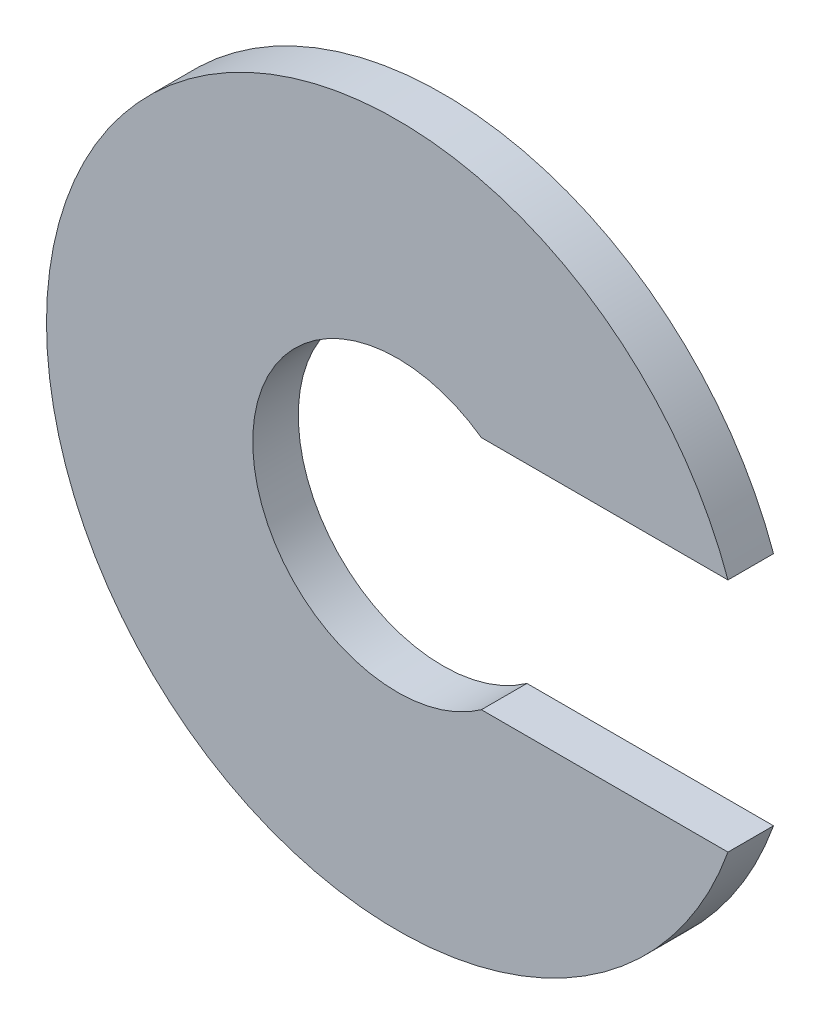
ISO-10303-21;
HEADER;
FILE_DESCRIPTION(('STEP AP214'),'2;1');
FILE_NAME('part.step','',(''),(''),'','','');
FILE_SCHEMA(('AUTOMOTIVE_DESIGN { 1 0 10303 214 1 1 1 1 }'));
ENDSEC;
DATA;
#1=APPLICATION_CONTEXT('core data for automotive mechanical design processes');
#2=APPLICATION_PROTOCOL_DEFINITION('international standard','automotive_design',2000,#1);
#3=PRODUCT_CONTEXT('',#1,'mechanical');
#4=PRODUCT('Part','Part','',(#3));
#5=PRODUCT_RELATED_PRODUCT_CATEGORY('part','',(#4));
#6=PRODUCT_DEFINITION_FORMATION('','',#4);
#7=PRODUCT_DEFINITION_CONTEXT('part definition',#1,'design');
#8=PRODUCT_DEFINITION('design','',#6,#7);
#9=PRODUCT_DEFINITION_SHAPE('','',#8);
#10=(LENGTH_UNIT() NAMED_UNIT(*) SI_UNIT(.MILLI.,.METRE.));
#11=(NAMED_UNIT(*) PLANE_ANGLE_UNIT() SI_UNIT($,.RADIAN.));
#12=(NAMED_UNIT(*) SI_UNIT($,.STERADIAN.) SOLID_ANGLE_UNIT());
#13=UNCERTAINTY_MEASURE_WITH_UNIT(LENGTH_MEASURE(1.E-05),#10,'distance_accuracy_value','');
#14=(GEOMETRIC_REPRESENTATION_CONTEXT(3) GLOBAL_UNCERTAINTY_ASSIGNED_CONTEXT((#13)) GLOBAL_UNIT_ASSIGNED_CONTEXT((#10,
#11,#12)) REPRESENTATION_CONTEXT('',''));
#15=CARTESIAN_POINT('',(0.,0.,0.));
#16=DIRECTION('',(0.,0.,1.));
#17=DIRECTION('',(1.,0.,0.));
#18=AXIS2_PLACEMENT_3D('',#15,#16,#17);
#19=CARTESIAN_POINT('',(0.,0.,0.739999999999991));
#20=DIRECTION('',(0.,0.,1.));
#21=DIRECTION('',(-1.,0.,0.));
#22=AXIS2_PLACEMENT_3D('',#19,#20,#21);
#23=PLANE('',#22);
#24=CARTESIAN_POINT('',(0.,0.,0.739999999999991));
#25=DIRECTION('',(0.,0.,1.));
#26=DIRECTION('',(1.,0.,0.));
#27=AXIS2_PLACEMENT_3D('',#24,#25,#26);
#28=CIRCLE('',#27,2.35000000000001);
#29=CARTESIAN_POINT('',(1.36381816969866,1.91376592090042,0.739999999999991));
#30=VERTEX_POINT('',#29);
#31=CARTESIAN_POINT('',(1.36381816969866,-1.91376592090042,0.739999999999991));
#32=VERTEX_POINT('',#31);
#33=EDGE_CURVE('E47',#30,#32,#28,.T.);
#34=ORIENTED_EDGE('',*,*,#33,.F.);
#35=DIRECTION('',(1.,0.,0.));
#36=VECTOR('',#35,1.);
#37=CARTESIAN_POINT('',(1.36381816969867,1.91376592090042,0.739999999999991));
#38=LINE('',#37,#36);
#39=CARTESIAN_POINT('',(5.36912469588854,1.91376592090042,0.739999999999994));
#40=VERTEX_POINT('',#39);
#41=EDGE_CURVE('E70',#30,#40,#38,.T.);
#42=ORIENTED_EDGE('',*,*,#41,.T.);
#43=CARTESIAN_POINT('',(0.,0.,0.739999999999991));
#44=DIRECTION('',(0.,0.,1.));
#45=DIRECTION('',(1.,0.,0.));
#46=AXIS2_PLACEMENT_3D('',#43,#44,#45);
#47=CIRCLE('',#46,5.7);
#48=CARTESIAN_POINT('',(5.36912469588854,-1.91376592090042,0.739999999999991));
#49=VERTEX_POINT('',#48);
#50=EDGE_CURVE('E75',#40,#49,#47,.T.);
#51=ORIENTED_EDGE('',*,*,#50,.T.);
#52=DIRECTION('',(1.,0.,0.));
#53=VECTOR('',#52,1.);
#54=CARTESIAN_POINT('',(1.36381816969867,-1.91376592090042,0.739999999999991));
#55=LINE('',#54,#53);
#56=EDGE_CURVE('E90',#32,#49,#55,.T.);
#57=ORIENTED_EDGE('',*,*,#56,.F.);
#58=EDGE_LOOP('',(#34,#42,#51,#57));
#59=FACE_BOUND('',#58,.T.);
#60=ADVANCED_FACE('F39',(#59),#23,.T.);
#61=CARTESIAN_POINT('',(0.,0.,0.));
#62=DIRECTION('',(0.,0.,1.));
#63=DIRECTION('',(1.,0.,0.));
#64=AXIS2_PLACEMENT_3D('',#61,#62,#63);
#65=PLANE('',#64);
#66=CARTESIAN_POINT('',(0.,0.,0.));
#67=DIRECTION('',(0.,0.,1.));
#68=DIRECTION('',(1.,0.,0.));
#69=AXIS2_PLACEMENT_3D('',#66,#67,#68);
#70=CIRCLE('',#69,2.35000000000001);
#71=CARTESIAN_POINT('',(1.36381816969866,1.91376592090042,0.));
#72=VERTEX_POINT('',#71);
#73=CARTESIAN_POINT('',(1.36381816969866,-1.91376592090042,0.));
#74=VERTEX_POINT('',#73);
#75=EDGE_CURVE('E99',#72,#74,#70,.T.);
#76=ORIENTED_EDGE('',*,*,#75,.T.);
#77=DIRECTION('',(1.,0.,0.));
#78=VECTOR('',#77,1.);
#79=CARTESIAN_POINT('',(1.36381816969866,-1.91376592090042,0.));
#80=LINE('',#79,#78);
#81=CARTESIAN_POINT('',(5.36912469588854,-1.91376592090042,0.));
#82=VERTEX_POINT('',#81);
#83=EDGE_CURVE('E88',#74,#82,#80,.T.);
#84=ORIENTED_EDGE('',*,*,#83,.T.);
#85=CARTESIAN_POINT('',(0.,0.,0.));
#86=DIRECTION('',(0.,0.,1.));
#87=DIRECTION('',(1.,0.,0.));
#88=AXIS2_PLACEMENT_3D('',#85,#86,#87);
#89=CIRCLE('',#88,5.7);
#90=CARTESIAN_POINT('',(5.36912469588854,1.91376592090042,0.));
#91=VERTEX_POINT('',#90);
#92=EDGE_CURVE('E92',#91,#82,#89,.T.);
#93=ORIENTED_EDGE('',*,*,#92,.F.);
#94=DIRECTION('',(1.,0.,0.));
#95=VECTOR('',#94,1.);
#96=CARTESIAN_POINT('',(1.36381816969866,1.91376592090042,0.));
#97=LINE('',#96,#95);
#98=EDGE_CURVE('E106',#72,#91,#97,.T.);
#99=ORIENTED_EDGE('',*,*,#98,.F.);
#100=EDGE_LOOP('',(#76,#84,#93,#99));
#101=FACE_BOUND('',#100,.T.);
#102=ADVANCED_FACE('F98',(#101),#65,.F.);
#103=CARTESIAN_POINT('',(1.36381816969866,-1.91376592090042,16.6297929984355));
#104=DIRECTION('',(0.,1.,0.));
#105=DIRECTION('',(-1.,0.,0.));
#106=AXIS2_PLACEMENT_3D('',#103,#104,#105);
#107=PLANE('',#106);
#108=DIRECTION('',(0.,0.,-1.));
#109=VECTOR('',#108,1.);
#110=CARTESIAN_POINT('',(1.36381816969866,-1.91376592090042,16.6297929984355));
#111=LINE('',#110,#109);
#112=EDGE_CURVE('E11',#32,#74,#111,.T.);
#113=ORIENTED_EDGE('',*,*,#112,.F.);
#114=ORIENTED_EDGE('',*,*,#56,.T.);
#115=DIRECTION('',(0.,0.,-1.));
#116=VECTOR('',#115,1.);
#117=CARTESIAN_POINT('',(5.36912469588854,-1.91376592090042,16.6297929984355));
#118=LINE('',#117,#116);
#119=EDGE_CURVE('E85',#49,#82,#118,.T.);
#120=ORIENTED_EDGE('',*,*,#119,.T.);
#121=ORIENTED_EDGE('',*,*,#83,.F.);
#122=EDGE_LOOP('',(#113,#114,#120,#121));
#123=FACE_BOUND('',#122,.T.);
#124=ADVANCED_FACE('F86',(#123),#107,.T.);
#125=CARTESIAN_POINT('',(0.,0.,16.6297929984355));
#126=DIRECTION('',(0.,0.,-1.));
#127=DIRECTION('',(-1.,0.,0.));
#128=AXIS2_PLACEMENT_3D('',#125,#126,#127);
#129=CYLINDRICAL_SURFACE('',#128,5.7);
#130=ORIENTED_EDGE('',*,*,#50,.F.);
#131=DIRECTION('',(0.,0.,-1.));
#132=VECTOR('',#131,1.);
#133=CARTESIAN_POINT('',(5.36912469588854,1.91376592090042,16.6297929984355));
#134=LINE('',#133,#132);
#135=EDGE_CURVE('E80',#40,#91,#134,.T.);
#136=ORIENTED_EDGE('',*,*,#135,.T.);
#137=ORIENTED_EDGE('',*,*,#92,.T.);
#138=ORIENTED_EDGE('',*,*,#119,.F.);
#139=EDGE_LOOP('',(#130,#136,#137,#138));
#140=FACE_BOUND('',#139,.T.);
#141=ADVANCED_FACE('F93',(#140),#129,.T.);
#142=CARTESIAN_POINT('',(1.36381816969866,1.91376592090042,16.6297929984355));
#143=DIRECTION('',(0.,1.,0.));
#144=DIRECTION('',(-1.,0.,0.));
#145=AXIS2_PLACEMENT_3D('',#142,#143,#144);
#146=PLANE('',#145);
#147=ORIENTED_EDGE('',*,*,#41,.F.);
#148=DIRECTION('',(0.,0.,-1.));
#149=VECTOR('',#148,1.);
#150=CARTESIAN_POINT('',(1.36381816969866,1.91376592090042,16.6297929984355));
#151=LINE('',#150,#149);
#152=EDGE_CURVE('E96',#30,#72,#151,.T.);
#153=ORIENTED_EDGE('',*,*,#152,.T.);
#154=ORIENTED_EDGE('',*,*,#98,.T.);
#155=ORIENTED_EDGE('',*,*,#135,.F.);
#156=EDGE_LOOP('',(#147,#153,#154,#155));
#157=FACE_BOUND('',#156,.T.);
#158=ADVANCED_FACE('F112',(#157),#146,.F.);
#159=CARTESIAN_POINT('',(0.,0.,16.6297929984355));
#160=DIRECTION('',(0.,0.,-1.));
#161=DIRECTION('',(-1.,0.,0.));
#162=AXIS2_PLACEMENT_3D('',#159,#160,#161);
#163=CYLINDRICAL_SURFACE('',#162,2.35000000000001);
#164=ORIENTED_EDGE('',*,*,#152,.F.);
#165=ORIENTED_EDGE('',*,*,#33,.T.);
#166=ORIENTED_EDGE('',*,*,#112,.T.);
#167=ORIENTED_EDGE('',*,*,#75,.F.);
#168=EDGE_LOOP('',(#164,#165,#166,#167));
#169=FACE_BOUND('',#168,.T.);
#170=ADVANCED_FACE('F113',(#169),#163,.F.);
#171=CLOSED_SHELL('',(#60,#102,#124,#141,#158,#170));
#172=MANIFOLD_SOLID_BREP('B2',#171);
#173=ADVANCED_BREP_SHAPE_REPRESENTATION('',(#18,#172),#14);
#174=SHAPE_DEFINITION_REPRESENTATION(#9,#173);
ENDSEC;
END-ISO-10303-21;
